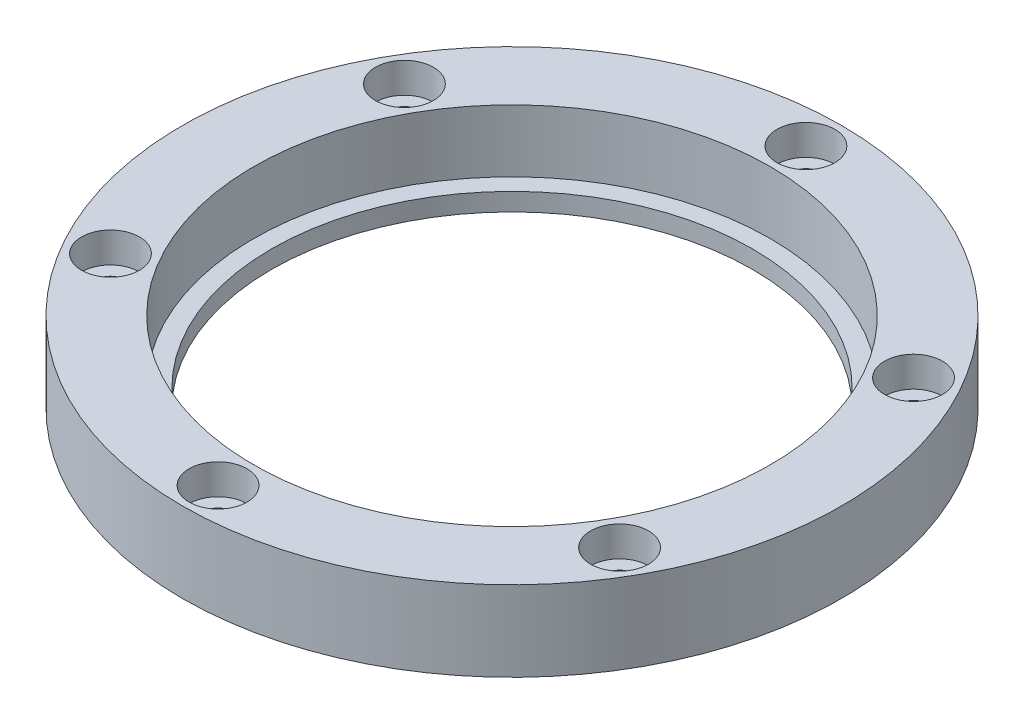
ISO-10303-21;
HEADER;
FILE_DESCRIPTION(('STEP AP214'),'2;1');
FILE_NAME('part.step','',(''),(''),'','','');
FILE_SCHEMA(('AUTOMOTIVE_DESIGN { 1 0 10303 214 1 1 1 1 }'));
ENDSEC;
DATA;
#1=APPLICATION_CONTEXT('core data for automotive mechanical design processes');
#2=APPLICATION_PROTOCOL_DEFINITION('international standard','automotive_design',2000,#1);
#3=PRODUCT_CONTEXT('',#1,'mechanical');
#4=PRODUCT('Part','Part','',(#3));
#5=PRODUCT_RELATED_PRODUCT_CATEGORY('part','',(#4));
#6=PRODUCT_DEFINITION_FORMATION('','',#4);
#7=PRODUCT_DEFINITION_CONTEXT('part definition',#1,'design');
#8=PRODUCT_DEFINITION('design','',#6,#7);
#9=PRODUCT_DEFINITION_SHAPE('','',#8);
#10=(LENGTH_UNIT() NAMED_UNIT(*) SI_UNIT(.MILLI.,.METRE.));
#11=(NAMED_UNIT(*) PLANE_ANGLE_UNIT() SI_UNIT($,.RADIAN.));
#12=(NAMED_UNIT(*) SI_UNIT($,.STERADIAN.) SOLID_ANGLE_UNIT());
#13=UNCERTAINTY_MEASURE_WITH_UNIT(LENGTH_MEASURE(1.E-05),#10,'distance_accuracy_value','');
#14=(GEOMETRIC_REPRESENTATION_CONTEXT(3) GLOBAL_UNCERTAINTY_ASSIGNED_CONTEXT((#13)) GLOBAL_UNIT_ASSIGNED_CONTEXT((#10,
#11,#12)) REPRESENTATION_CONTEXT('',''));
#15=CARTESIAN_POINT('',(0.,0.,0.));
#16=DIRECTION('',(0.,0.,1.));
#17=DIRECTION('',(1.,0.,0.));
#18=AXIS2_PLACEMENT_3D('',#15,#16,#17);
#19=CARTESIAN_POINT('',(0.,0.,0.));
#20=DIRECTION('',(0.,-1.,0.));
#21=DIRECTION('',(0.,0.,-1.));
#22=AXIS2_PLACEMENT_3D('',#19,#20,#21);
#23=CYLINDRICAL_SURFACE('',#22,27.);
#24=CARTESIAN_POINT('',(0.,0.,0.));
#25=DIRECTION('',(0.,-1.,0.));
#26=DIRECTION('',(0.,0.,-1.));
#27=AXIS2_PLACEMENT_3D('',#24,#25,#26);
#28=CIRCLE('',#27,27.);
#29=CARTESIAN_POINT('',(0.,0.,-27.));
#30=VERTEX_POINT('',#29);
#31=EDGE_CURVE('E10',#30,#30,#28,.T.);
#32=ORIENTED_EDGE('',*,*,#31,.T.);
#33=EDGE_LOOP('',(#32));
#34=FACE_BOUND('',#33,.T.);
#35=CARTESIAN_POINT('',(0.,2.,0.));
#36=DIRECTION('',(0.,-1.,0.));
#37=DIRECTION('',(0.,0.,-1.));
#38=AXIS2_PLACEMENT_3D('',#35,#36,#37);
#39=CIRCLE('',#38,27.);
#40=CARTESIAN_POINT('',(0.,2.,-27.));
#41=VERTEX_POINT('',#40);
#42=EDGE_CURVE('E70',#41,#41,#39,.T.);
#43=ORIENTED_EDGE('',*,*,#42,.F.);
#44=EDGE_LOOP('',(#43));
#45=FACE_BOUND('',#44,.T.);
#46=ADVANCED_FACE('F43',(#34,#45),#23,.F.);
#47=CARTESIAN_POINT('',(27.,0.,0.));
#48=DIRECTION('',(0.,-1.,0.));
#49=DIRECTION('',(0.,0.,-1.));
#50=AXIS2_PLACEMENT_3D('',#47,#48,#49);
#51=PLANE('',#50);
#52=CARTESIAN_POINT('',(0.,0.,33.));
#53=DIRECTION('',(0.,1.,0.));
#54=DIRECTION('',(0.,0.,1.));
#55=AXIS2_PLACEMENT_3D('',#52,#53,#54);
#56=CIRCLE('',#55,1.7);
#57=CARTESIAN_POINT('',(0.,0.,34.7));
#58=VERTEX_POINT('',#57);
#59=EDGE_CURVE('E154',#58,#58,#56,.T.);
#60=ORIENTED_EDGE('',*,*,#59,.T.);
#61=EDGE_LOOP('',(#60));
#62=FACE_BOUND('',#61,.T.);
#63=CARTESIAN_POINT('',(-28.5788383248865,0.,16.4999999999999));
#64=DIRECTION('',(0.,1.,0.));
#65=DIRECTION('',(0.,0.,1.));
#66=AXIS2_PLACEMENT_3D('',#63,#64,#65);
#67=CIRCLE('',#66,1.7);
#68=CARTESIAN_POINT('',(-28.5788383248865,0.,18.1999999999999));
#69=VERTEX_POINT('',#68);
#70=EDGE_CURVE('E138',#69,#69,#67,.T.);
#71=ORIENTED_EDGE('',*,*,#70,.T.);
#72=EDGE_LOOP('',(#71));
#73=FACE_BOUND('',#72,.T.);
#74=CARTESIAN_POINT('',(-28.5788383248864,0.,-16.5000000000001));
#75=DIRECTION('',(0.,1.,0.));
#76=DIRECTION('',(0.,0.,1.));
#77=AXIS2_PLACEMENT_3D('',#74,#75,#76);
#78=CIRCLE('',#77,1.7);
#79=CARTESIAN_POINT('',(-28.5788383248864,0.,-14.8000000000001));
#80=VERTEX_POINT('',#79);
#81=EDGE_CURVE('E122',#80,#80,#78,.T.);
#82=ORIENTED_EDGE('',*,*,#81,.T.);
#83=EDGE_LOOP('',(#82));
#84=FACE_BOUND('',#83,.T.);
#85=CARTESIAN_POINT('',(2.30437768363647E-13,0.,-33.));
#86=DIRECTION('',(0.,1.,0.));
#87=DIRECTION('',(0.,0.,1.));
#88=AXIS2_PLACEMENT_3D('',#85,#86,#87);
#89=CIRCLE('',#88,1.7);
#90=CARTESIAN_POINT('',(2.30437768363647E-13,0.,-31.3));
#91=VERTEX_POINT('',#90);
#92=EDGE_CURVE('E106',#91,#91,#89,.T.);
#93=ORIENTED_EDGE('',*,*,#92,.T.);
#94=EDGE_LOOP('',(#93));
#95=FACE_BOUND('',#94,.T.);
#96=CARTESIAN_POINT('',(28.5788383248866,0.,-16.4999999999997));
#97=DIRECTION('',(0.,1.,0.));
#98=DIRECTION('',(0.,0.,1.));
#99=AXIS2_PLACEMENT_3D('',#96,#97,#98);
#100=CIRCLE('',#99,1.7);
#101=CARTESIAN_POINT('',(28.5788383248866,0.,-14.7999999999997));
#102=VERTEX_POINT('',#101);
#103=EDGE_CURVE('E90',#102,#102,#100,.T.);
#104=ORIENTED_EDGE('',*,*,#103,.T.);
#105=EDGE_LOOP('',(#104));
#106=FACE_BOUND('',#105,.T.);
#107=CARTESIAN_POINT('',(28.5788383248863,0.,16.5000000000003));
#108=DIRECTION('',(0.,1.,0.));
#109=DIRECTION('',(0.,0.,1.));
#110=AXIS2_PLACEMENT_3D('',#107,#108,#109);
#111=CIRCLE('',#110,1.7);
#112=CARTESIAN_POINT('',(28.5788383248863,0.,18.2000000000003));
#113=VERTEX_POINT('',#112);
#114=EDGE_CURVE('E74',#113,#113,#111,.T.);
#115=ORIENTED_EDGE('',*,*,#114,.T.);
#116=EDGE_LOOP('',(#115));
#117=FACE_BOUND('',#116,.T.);
#118=CARTESIAN_POINT('',(0.,0.,0.));
#119=DIRECTION('',(0.,-1.,0.));
#120=DIRECTION('',(0.,0.,-1.));
#121=AXIS2_PLACEMENT_3D('',#118,#119,#120);
#122=CIRCLE('',#121,37.);
#123=CARTESIAN_POINT('',(0.,0.,-37.));
#124=VERTEX_POINT('',#123);
#125=EDGE_CURVE('E50',#124,#124,#122,.T.);
#126=ORIENTED_EDGE('',*,*,#125,.T.);
#127=EDGE_LOOP('',(#126));
#128=FACE_BOUND('',#127,.T.);
#129=ORIENTED_EDGE('',*,*,#31,.F.);
#130=EDGE_LOOP('',(#129));
#131=FACE_BOUND('',#130,.T.);
#132=ADVANCED_FACE('F195',(#62,#73,#84,#95,#106,#117,#128,#131),#51,.T.);
#133=CARTESIAN_POINT('',(0.,0.,0.));
#134=DIRECTION('',(0.,-1.,0.));
#135=DIRECTION('',(0.,0.,-1.));
#136=AXIS2_PLACEMENT_3D('',#133,#134,#135);
#137=CYLINDRICAL_SURFACE('',#136,37.);
#138=CARTESIAN_POINT('',(0.,9.,0.));
#139=DIRECTION('',(0.,-1.,0.));
#140=DIRECTION('',(0.,0.,-1.));
#141=AXIS2_PLACEMENT_3D('',#138,#139,#140);
#142=CIRCLE('',#141,37.);
#143=CARTESIAN_POINT('',(0.,9.,-37.));
#144=VERTEX_POINT('',#143);
#145=EDGE_CURVE('E55',#144,#144,#142,.T.);
#146=ORIENTED_EDGE('',*,*,#145,.T.);
#147=EDGE_LOOP('',(#146));
#148=FACE_BOUND('',#147,.T.);
#149=ORIENTED_EDGE('',*,*,#125,.F.);
#150=EDGE_LOOP('',(#149));
#151=FACE_BOUND('',#150,.T.);
#152=ADVANCED_FACE('F177',(#148,#151),#137,.T.);
#153=CARTESIAN_POINT('',(37.,9.,0.));
#154=DIRECTION('',(0.,1.,0.));
#155=DIRECTION('',(0.,0.,1.));
#156=AXIS2_PLACEMENT_3D('',#153,#154,#155);
#157=PLANE('',#156);
#158=CARTESIAN_POINT('',(0.,9.,33.));
#159=DIRECTION('',(0.,1.,0.));
#160=DIRECTION('',(0.,0.,1.));
#161=AXIS2_PLACEMENT_3D('',#158,#159,#160);
#162=CIRCLE('',#161,3.25);
#163=CARTESIAN_POINT('',(0.,9.,36.25));
#164=VERTEX_POINT('',#163);
#165=EDGE_CURVE('E166',#164,#164,#162,.T.);
#166=ORIENTED_EDGE('',*,*,#165,.F.);
#167=EDGE_LOOP('',(#166));
#168=FACE_BOUND('',#167,.T.);
#169=CARTESIAN_POINT('',(-28.5788383248865,9.,16.4999999999999));
#170=DIRECTION('',(0.,1.,0.));
#171=DIRECTION('',(0.,0.,1.));
#172=AXIS2_PLACEMENT_3D('',#169,#170,#171);
#173=CIRCLE('',#172,3.25);
#174=CARTESIAN_POINT('',(-28.5788383248865,9.,19.7499999999999));
#175=VERTEX_POINT('',#174);
#176=EDGE_CURVE('E150',#175,#175,#173,.T.);
#177=ORIENTED_EDGE('',*,*,#176,.F.);
#178=EDGE_LOOP('',(#177));
#179=FACE_BOUND('',#178,.T.);
#180=CARTESIAN_POINT('',(-28.5788383248864,9.,-16.5000000000001));
#181=DIRECTION('',(0.,1.,0.));
#182=DIRECTION('',(0.,0.,1.));
#183=AXIS2_PLACEMENT_3D('',#180,#181,#182);
#184=CIRCLE('',#183,3.25);
#185=CARTESIAN_POINT('',(-28.5788383248864,9.,-13.2500000000001));
#186=VERTEX_POINT('',#185);
#187=EDGE_CURVE('E134',#186,#186,#184,.T.);
#188=ORIENTED_EDGE('',*,*,#187,.F.);
#189=EDGE_LOOP('',(#188));
#190=FACE_BOUND('',#189,.T.);
#191=CARTESIAN_POINT('',(2.30437768363647E-13,9.,-33.));
#192=DIRECTION('',(0.,1.,0.));
#193=DIRECTION('',(0.,0.,1.));
#194=AXIS2_PLACEMENT_3D('',#191,#192,#193);
#195=CIRCLE('',#194,3.25);
#196=CARTESIAN_POINT('',(2.30437768363647E-13,9.,-29.75));
#197=VERTEX_POINT('',#196);
#198=EDGE_CURVE('E118',#197,#197,#195,.T.);
#199=ORIENTED_EDGE('',*,*,#198,.F.);
#200=EDGE_LOOP('',(#199));
#201=FACE_BOUND('',#200,.T.);
#202=CARTESIAN_POINT('',(28.5788383248866,9.,-16.4999999999997));
#203=DIRECTION('',(0.,1.,0.));
#204=DIRECTION('',(0.,0.,1.));
#205=AXIS2_PLACEMENT_3D('',#202,#203,#204);
#206=CIRCLE('',#205,3.24999999999999);
#207=CARTESIAN_POINT('',(28.5788383248866,9.,-13.2499999999997));
#208=VERTEX_POINT('',#207);
#209=EDGE_CURVE('E102',#208,#208,#206,.T.);
#210=ORIENTED_EDGE('',*,*,#209,.F.);
#211=EDGE_LOOP('',(#210));
#212=FACE_BOUND('',#211,.T.);
#213=CARTESIAN_POINT('',(28.5788383248863,9.,16.5000000000003));
#214=DIRECTION('',(0.,1.,0.));
#215=DIRECTION('',(0.,0.,1.));
#216=AXIS2_PLACEMENT_3D('',#213,#214,#215);
#217=CIRCLE('',#216,3.25);
#218=CARTESIAN_POINT('',(28.5788383248863,9.,19.7500000000003));
#219=VERTEX_POINT('',#218);
#220=EDGE_CURVE('E86',#219,#219,#217,.T.);
#221=ORIENTED_EDGE('',*,*,#220,.F.);
#222=EDGE_LOOP('',(#221));
#223=FACE_BOUND('',#222,.T.);
#224=CARTESIAN_POINT('',(0.,9.,0.));
#225=DIRECTION('',(0.,-1.,0.));
#226=DIRECTION('',(0.,0.,-1.));
#227=AXIS2_PLACEMENT_3D('',#224,#225,#226);
#228=CIRCLE('',#227,29.);
#229=CARTESIAN_POINT('',(0.,9.,-29.));
#230=VERTEX_POINT('',#229);
#231=EDGE_CURVE('E60',#230,#230,#228,.T.);
#232=ORIENTED_EDGE('',*,*,#231,.T.);
#233=EDGE_LOOP('',(#232));
#234=FACE_BOUND('',#233,.T.);
#235=ORIENTED_EDGE('',*,*,#145,.F.);
#236=EDGE_LOOP('',(#235));
#237=FACE_BOUND('',#236,.T.);
#238=ADVANCED_FACE('F173',(#168,#179,#190,#201,#212,#223,#234,#237),#157,.T.);
#239=CARTESIAN_POINT('',(0.,0.,0.));
#240=DIRECTION('',(0.,-1.,0.));
#241=DIRECTION('',(0.,0.,-1.));
#242=AXIS2_PLACEMENT_3D('',#239,#240,#241);
#243=CYLINDRICAL_SURFACE('',#242,29.);
#244=CARTESIAN_POINT('',(0.,2.,0.));
#245=DIRECTION('',(0.,-1.,0.));
#246=DIRECTION('',(0.,0.,-1.));
#247=AXIS2_PLACEMENT_3D('',#244,#245,#246);
#248=CIRCLE('',#247,29.);
#249=CARTESIAN_POINT('',(0.,2.,-29.));
#250=VERTEX_POINT('',#249);
#251=EDGE_CURVE('E66',#250,#250,#248,.T.);
#252=ORIENTED_EDGE('',*,*,#251,.T.);
#253=EDGE_LOOP('',(#252));
#254=FACE_BOUND('',#253,.T.);
#255=ORIENTED_EDGE('',*,*,#231,.F.);
#256=EDGE_LOOP('',(#255));
#257=FACE_BOUND('',#256,.T.);
#258=ADVANCED_FACE('F176',(#254,#257),#243,.F.);
#259=CARTESIAN_POINT('',(29.,2.,0.));
#260=DIRECTION('',(0.,1.,0.));
#261=DIRECTION('',(0.,0.,1.));
#262=AXIS2_PLACEMENT_3D('',#259,#260,#261);
#263=PLANE('',#262);
#264=ORIENTED_EDGE('',*,*,#42,.T.);
#265=EDGE_LOOP('',(#264));
#266=FACE_BOUND('',#265,.T.);
#267=ORIENTED_EDGE('',*,*,#251,.F.);
#268=EDGE_LOOP('',(#267));
#269=FACE_BOUND('',#268,.T.);
#270=ADVANCED_FACE('F208',(#266,#269),#263,.T.);
#271=CARTESIAN_POINT('',(28.5788383248863,9.,16.5000000000003));
#272=DIRECTION('',(0.,1.,0.));
#273=DIRECTION('',(0.,0.,1.));
#274=AXIS2_PLACEMENT_3D('',#271,#272,#273);
#275=CYLINDRICAL_SURFACE('',#274,1.70000000000001);
#276=ORIENTED_EDGE('',*,*,#114,.F.);
#277=EDGE_LOOP('',(#276));
#278=FACE_BOUND('',#277,.T.);
#279=CARTESIAN_POINT('',(28.5788383248863,5.6,16.5000000000003));
#280=DIRECTION('',(0.,1.,0.));
#281=DIRECTION('',(0.,0.,1.));
#282=AXIS2_PLACEMENT_3D('',#279,#280,#281);
#283=CIRCLE('',#282,1.70000000000001);
#284=CARTESIAN_POINT('',(28.5788383248863,5.6,18.2000000000003));
#285=VERTEX_POINT('',#284);
#286=EDGE_CURVE('E78',#285,#285,#283,.T.);
#287=ORIENTED_EDGE('',*,*,#286,.T.);
#288=EDGE_LOOP('',(#287));
#289=FACE_BOUND('',#288,.T.);
#290=ADVANCED_FACE('F211',(#278,#289),#275,.F.);
#291=CARTESIAN_POINT('',(30.2788383248863,5.6,16.5000000000003));
#292=DIRECTION('',(0.,-1.,0.));
#293=DIRECTION('',(0.,0.,-1.));
#294=AXIS2_PLACEMENT_3D('',#291,#292,#293);
#295=PLANE('',#294);
#296=ORIENTED_EDGE('',*,*,#286,.F.);
#297=EDGE_LOOP('',(#296));
#298=FACE_BOUND('',#297,.T.);
#299=CARTESIAN_POINT('',(28.5788383248863,5.6,16.5000000000003));
#300=DIRECTION('',(0.,1.,0.));
#301=DIRECTION('',(0.,0.,1.));
#302=AXIS2_PLACEMENT_3D('',#299,#300,#301);
#303=CIRCLE('',#302,3.25);
#304=CARTESIAN_POINT('',(28.5788383248863,5.6,19.7500000000003));
#305=VERTEX_POINT('',#304);
#306=EDGE_CURVE('E82',#305,#305,#303,.T.);
#307=ORIENTED_EDGE('',*,*,#306,.T.);
#308=EDGE_LOOP('',(#307));
#309=FACE_BOUND('',#308,.T.);
#310=ADVANCED_FACE('F222',(#298,#309),#295,.F.);
#311=CARTESIAN_POINT('',(28.5788383248863,9.,16.5000000000003));
#312=DIRECTION('',(0.,1.,0.));
#313=DIRECTION('',(0.,0.,1.));
#314=AXIS2_PLACEMENT_3D('',#311,#312,#313);
#315=CYLINDRICAL_SURFACE('',#314,3.25);
#316=ORIENTED_EDGE('',*,*,#306,.F.);
#317=EDGE_LOOP('',(#316));
#318=FACE_BOUND('',#317,.T.);
#319=ORIENTED_EDGE('',*,*,#220,.T.);
#320=EDGE_LOOP('',(#319));
#321=FACE_BOUND('',#320,.T.);
#322=ADVANCED_FACE('F226',(#318,#321),#315,.F.);
#323=CARTESIAN_POINT('',(28.5788383248866,9.,-16.4999999999997));
#324=DIRECTION('',(0.,1.,0.));
#325=DIRECTION('',(0.,0.,1.));
#326=AXIS2_PLACEMENT_3D('',#323,#324,#325);
#327=CYLINDRICAL_SURFACE('',#326,1.7);
#328=ORIENTED_EDGE('',*,*,#103,.F.);
#329=EDGE_LOOP('',(#328));
#330=FACE_BOUND('',#329,.T.);
#331=CARTESIAN_POINT('',(28.5788383248866,5.6,-16.4999999999997));
#332=DIRECTION('',(0.,1.,0.));
#333=DIRECTION('',(0.,0.,1.));
#334=AXIS2_PLACEMENT_3D('',#331,#332,#333);
#335=CIRCLE('',#334,1.70000000000001);
#336=CARTESIAN_POINT('',(28.5788383248866,5.6,-14.7999999999997));
#337=VERTEX_POINT('',#336);
#338=EDGE_CURVE('E94',#337,#337,#335,.T.);
#339=ORIENTED_EDGE('',*,*,#338,.T.);
#340=EDGE_LOOP('',(#339));
#341=FACE_BOUND('',#340,.T.);
#342=ADVANCED_FACE('F230',(#330,#341),#327,.F.);
#343=CARTESIAN_POINT('',(30.2788383248866,5.6,-16.4999999999997));
#344=DIRECTION('',(0.,-1.,0.));
#345=DIRECTION('',(0.,0.,-1.));
#346=AXIS2_PLACEMENT_3D('',#343,#344,#345);
#347=PLANE('',#346);
#348=ORIENTED_EDGE('',*,*,#338,.F.);
#349=EDGE_LOOP('',(#348));
#350=FACE_BOUND('',#349,.T.);
#351=CARTESIAN_POINT('',(28.5788383248866,5.6,-16.4999999999997));
#352=DIRECTION('',(0.,1.,0.));
#353=DIRECTION('',(0.,0.,1.));
#354=AXIS2_PLACEMENT_3D('',#351,#352,#353);
#355=CIRCLE('',#354,3.24999999999999);
#356=CARTESIAN_POINT('',(28.5788383248866,5.6,-13.2499999999997));
#357=VERTEX_POINT('',#356);
#358=EDGE_CURVE('E98',#357,#357,#355,.T.);
#359=ORIENTED_EDGE('',*,*,#358,.T.);
#360=EDGE_LOOP('',(#359));
#361=FACE_BOUND('',#360,.T.);
#362=ADVANCED_FACE('F234',(#350,#361),#347,.F.);
#363=CARTESIAN_POINT('',(28.5788383248866,9.,-16.4999999999997));
#364=DIRECTION('',(0.,1.,0.));
#365=DIRECTION('',(0.,0.,1.));
#366=AXIS2_PLACEMENT_3D('',#363,#364,#365);
#367=CYLINDRICAL_SURFACE('',#366,3.24999999999999);
#368=ORIENTED_EDGE('',*,*,#358,.F.);
#369=EDGE_LOOP('',(#368));
#370=FACE_BOUND('',#369,.T.);
#371=ORIENTED_EDGE('',*,*,#209,.T.);
#372=EDGE_LOOP('',(#371));
#373=FACE_BOUND('',#372,.T.);
#374=ADVANCED_FACE('F238',(#370,#373),#367,.F.);
#375=CARTESIAN_POINT('',(2.30437768363647E-13,9.,-33.));
#376=DIRECTION('',(0.,1.,0.));
#377=DIRECTION('',(0.,0.,1.));
#378=AXIS2_PLACEMENT_3D('',#375,#376,#377);
#379=CYLINDRICAL_SURFACE('',#378,1.7);
#380=ORIENTED_EDGE('',*,*,#92,.F.);
#381=EDGE_LOOP('',(#380));
#382=FACE_BOUND('',#381,.T.);
#383=CARTESIAN_POINT('',(2.30437768363647E-13,5.6,-33.));
#384=DIRECTION('',(0.,1.,0.));
#385=DIRECTION('',(0.,0.,1.));
#386=AXIS2_PLACEMENT_3D('',#383,#384,#385);
#387=CIRCLE('',#386,1.70000000000001);
#388=CARTESIAN_POINT('',(2.30437768363647E-13,5.6,-31.3));
#389=VERTEX_POINT('',#388);
#390=EDGE_CURVE('E110',#389,#389,#387,.T.);
#391=ORIENTED_EDGE('',*,*,#390,.T.);
#392=EDGE_LOOP('',(#391));
#393=FACE_BOUND('',#392,.T.);
#394=ADVANCED_FACE('F242',(#382,#393),#379,.F.);
#395=CARTESIAN_POINT('',(1.70000000000024,5.6,-33.));
#396=DIRECTION('',(0.,-1.,0.));
#397=DIRECTION('',(0.,0.,-1.));
#398=AXIS2_PLACEMENT_3D('',#395,#396,#397);
#399=PLANE('',#398);
#400=ORIENTED_EDGE('',*,*,#390,.F.);
#401=EDGE_LOOP('',(#400));
#402=FACE_BOUND('',#401,.T.);
#403=CARTESIAN_POINT('',(2.30437768363647E-13,5.6,-33.));
#404=DIRECTION('',(0.,1.,0.));
#405=DIRECTION('',(0.,0.,1.));
#406=AXIS2_PLACEMENT_3D('',#403,#404,#405);
#407=CIRCLE('',#406,3.25);
#408=CARTESIAN_POINT('',(2.30437768363647E-13,5.6,-29.75));
#409=VERTEX_POINT('',#408);
#410=EDGE_CURVE('E114',#409,#409,#407,.T.);
#411=ORIENTED_EDGE('',*,*,#410,.T.);
#412=EDGE_LOOP('',(#411));
#413=FACE_BOUND('',#412,.T.);
#414=ADVANCED_FACE('F246',(#402,#413),#399,.F.);
#415=CARTESIAN_POINT('',(2.30437768363647E-13,9.,-33.));
#416=DIRECTION('',(0.,1.,0.));
#417=DIRECTION('',(0.,0.,1.));
#418=AXIS2_PLACEMENT_3D('',#415,#416,#417);
#419=CYLINDRICAL_SURFACE('',#418,3.25);
#420=ORIENTED_EDGE('',*,*,#410,.F.);
#421=EDGE_LOOP('',(#420));
#422=FACE_BOUND('',#421,.T.);
#423=ORIENTED_EDGE('',*,*,#198,.T.);
#424=EDGE_LOOP('',(#423));
#425=FACE_BOUND('',#424,.T.);
#426=ADVANCED_FACE('F250',(#422,#425),#419,.F.);
#427=CARTESIAN_POINT('',(-28.5788383248864,9.,-16.5000000000001));
#428=DIRECTION('',(0.,1.,0.));
#429=DIRECTION('',(0.,0.,1.));
#430=AXIS2_PLACEMENT_3D('',#427,#428,#429);
#431=CYLINDRICAL_SURFACE('',#430,1.70000000000001);
#432=ORIENTED_EDGE('',*,*,#81,.F.);
#433=EDGE_LOOP('',(#432));
#434=FACE_BOUND('',#433,.T.);
#435=CARTESIAN_POINT('',(-28.5788383248864,5.6,-16.5000000000001));
#436=DIRECTION('',(0.,1.,0.));
#437=DIRECTION('',(0.,0.,1.));
#438=AXIS2_PLACEMENT_3D('',#435,#436,#437);
#439=CIRCLE('',#438,1.70000000000001);
#440=CARTESIAN_POINT('',(-28.5788383248864,5.6,-14.8000000000001));
#441=VERTEX_POINT('',#440);
#442=EDGE_CURVE('E126',#441,#441,#439,.T.);
#443=ORIENTED_EDGE('',*,*,#442,.T.);
#444=EDGE_LOOP('',(#443));
#445=FACE_BOUND('',#444,.T.);
#446=ADVANCED_FACE('F254',(#434,#445),#431,.F.);
#447=CARTESIAN_POINT('',(-26.8788383248864,5.6,-16.5000000000001));
#448=DIRECTION('',(0.,-1.,0.));
#449=DIRECTION('',(0.,0.,-1.));
#450=AXIS2_PLACEMENT_3D('',#447,#448,#449);
#451=PLANE('',#450);
#452=ORIENTED_EDGE('',*,*,#442,.F.);
#453=EDGE_LOOP('',(#452));
#454=FACE_BOUND('',#453,.T.);
#455=CARTESIAN_POINT('',(-28.5788383248864,5.6,-16.5000000000001));
#456=DIRECTION('',(0.,1.,0.));
#457=DIRECTION('',(0.,0.,1.));
#458=AXIS2_PLACEMENT_3D('',#455,#456,#457);
#459=CIRCLE('',#458,3.25);
#460=CARTESIAN_POINT('',(-28.5788383248864,5.6,-13.2500000000001));
#461=VERTEX_POINT('',#460);
#462=EDGE_CURVE('E130',#461,#461,#459,.T.);
#463=ORIENTED_EDGE('',*,*,#462,.T.);
#464=EDGE_LOOP('',(#463));
#465=FACE_BOUND('',#464,.T.);
#466=ADVANCED_FACE('F258',(#454,#465),#451,.F.);
#467=CARTESIAN_POINT('',(-28.5788383248864,9.,-16.5000000000001));
#468=DIRECTION('',(0.,1.,0.));
#469=DIRECTION('',(0.,0.,1.));
#470=AXIS2_PLACEMENT_3D('',#467,#468,#469);
#471=CYLINDRICAL_SURFACE('',#470,3.25);
#472=ORIENTED_EDGE('',*,*,#462,.F.);
#473=EDGE_LOOP('',(#472));
#474=FACE_BOUND('',#473,.T.);
#475=ORIENTED_EDGE('',*,*,#187,.T.);
#476=EDGE_LOOP('',(#475));
#477=FACE_BOUND('',#476,.T.);
#478=ADVANCED_FACE('F262',(#474,#477),#471,.F.);
#479=CARTESIAN_POINT('',(-28.5788383248865,9.,16.4999999999999));
#480=DIRECTION('',(0.,1.,0.));
#481=DIRECTION('',(0.,0.,1.));
#482=AXIS2_PLACEMENT_3D('',#479,#480,#481);
#483=CYLINDRICAL_SURFACE('',#482,1.70000000000001);
#484=ORIENTED_EDGE('',*,*,#70,.F.);
#485=EDGE_LOOP('',(#484));
#486=FACE_BOUND('',#485,.T.);
#487=CARTESIAN_POINT('',(-28.5788383248865,5.6,16.4999999999999));
#488=DIRECTION('',(0.,1.,0.));
#489=DIRECTION('',(0.,0.,1.));
#490=AXIS2_PLACEMENT_3D('',#487,#488,#489);
#491=CIRCLE('',#490,1.70000000000001);
#492=CARTESIAN_POINT('',(-28.5788383248865,5.6,18.1999999999999));
#493=VERTEX_POINT('',#492);
#494=EDGE_CURVE('E142',#493,#493,#491,.T.);
#495=ORIENTED_EDGE('',*,*,#494,.T.);
#496=EDGE_LOOP('',(#495));
#497=FACE_BOUND('',#496,.T.);
#498=ADVANCED_FACE('F266',(#486,#497),#483,.F.);
#499=CARTESIAN_POINT('',(-26.8788383248865,5.6,16.4999999999999));
#500=DIRECTION('',(0.,-1.,0.));
#501=DIRECTION('',(0.,0.,-1.));
#502=AXIS2_PLACEMENT_3D('',#499,#500,#501);
#503=PLANE('',#502);
#504=ORIENTED_EDGE('',*,*,#494,.F.);
#505=EDGE_LOOP('',(#504));
#506=FACE_BOUND('',#505,.T.);
#507=CARTESIAN_POINT('',(-28.5788383248865,5.6,16.4999999999999));
#508=DIRECTION('',(0.,1.,0.));
#509=DIRECTION('',(0.,0.,1.));
#510=AXIS2_PLACEMENT_3D('',#507,#508,#509);
#511=CIRCLE('',#510,3.25);
#512=CARTESIAN_POINT('',(-28.5788383248865,5.6,19.7499999999999));
#513=VERTEX_POINT('',#512);
#514=EDGE_CURVE('E146',#513,#513,#511,.T.);
#515=ORIENTED_EDGE('',*,*,#514,.T.);
#516=EDGE_LOOP('',(#515));
#517=FACE_BOUND('',#516,.T.);
#518=ADVANCED_FACE('F270',(#506,#517),#503,.F.);
#519=CARTESIAN_POINT('',(-28.5788383248865,9.,16.4999999999999));
#520=DIRECTION('',(0.,1.,0.));
#521=DIRECTION('',(0.,0.,1.));
#522=AXIS2_PLACEMENT_3D('',#519,#520,#521);
#523=CYLINDRICAL_SURFACE('',#522,3.25);
#524=ORIENTED_EDGE('',*,*,#514,.F.);
#525=EDGE_LOOP('',(#524));
#526=FACE_BOUND('',#525,.T.);
#527=ORIENTED_EDGE('',*,*,#176,.T.);
#528=EDGE_LOOP('',(#527));
#529=FACE_BOUND('',#528,.T.);
#530=ADVANCED_FACE('F274',(#526,#529),#523,.F.);
#531=CARTESIAN_POINT('',(0.,9.,33.));
#532=DIRECTION('',(0.,1.,0.));
#533=DIRECTION('',(0.,0.,1.));
#534=AXIS2_PLACEMENT_3D('',#531,#532,#533);
#535=CYLINDRICAL_SURFACE('',#534,1.7);
#536=ORIENTED_EDGE('',*,*,#59,.F.);
#537=EDGE_LOOP('',(#536));
#538=FACE_BOUND('',#537,.T.);
#539=CARTESIAN_POINT('',(0.,5.6,33.));
#540=DIRECTION('',(0.,1.,0.));
#541=DIRECTION('',(0.,0.,1.));
#542=AXIS2_PLACEMENT_3D('',#539,#540,#541);
#543=CIRCLE('',#542,1.70000000000001);
#544=CARTESIAN_POINT('',(0.,5.6,34.7));
#545=VERTEX_POINT('',#544);
#546=EDGE_CURVE('E158',#545,#545,#543,.T.);
#547=ORIENTED_EDGE('',*,*,#546,.T.);
#548=EDGE_LOOP('',(#547));
#549=FACE_BOUND('',#548,.T.);
#550=ADVANCED_FACE('F278',(#538,#549),#535,.F.);
#551=CARTESIAN_POINT('',(1.70000000000001,5.6,33.));
#552=DIRECTION('',(0.,-1.,0.));
#553=DIRECTION('',(0.,0.,-1.));
#554=AXIS2_PLACEMENT_3D('',#551,#552,#553);
#555=PLANE('',#554);
#556=ORIENTED_EDGE('',*,*,#546,.F.);
#557=EDGE_LOOP('',(#556));
#558=FACE_BOUND('',#557,.T.);
#559=CARTESIAN_POINT('',(0.,5.6,33.));
#560=DIRECTION('',(0.,1.,0.));
#561=DIRECTION('',(0.,0.,1.));
#562=AXIS2_PLACEMENT_3D('',#559,#560,#561);
#563=CIRCLE('',#562,3.25);
#564=CARTESIAN_POINT('',(0.,5.6,36.25));
#565=VERTEX_POINT('',#564);
#566=EDGE_CURVE('E162',#565,#565,#563,.T.);
#567=ORIENTED_EDGE('',*,*,#566,.T.);
#568=EDGE_LOOP('',(#567));
#569=FACE_BOUND('',#568,.T.);
#570=ADVANCED_FACE('F282',(#558,#569),#555,.F.);
#571=CARTESIAN_POINT('',(0.,9.,33.));
#572=DIRECTION('',(0.,1.,0.));
#573=DIRECTION('',(0.,0.,1.));
#574=AXIS2_PLACEMENT_3D('',#571,#572,#573);
#575=CYLINDRICAL_SURFACE('',#574,3.25);
#576=ORIENTED_EDGE('',*,*,#566,.F.);
#577=EDGE_LOOP('',(#576));
#578=FACE_BOUND('',#577,.T.);
#579=ORIENTED_EDGE('',*,*,#165,.T.);
#580=EDGE_LOOP('',(#579));
#581=FACE_BOUND('',#580,.T.);
#582=ADVANCED_FACE('F171',(#578,#581),#575,.F.);
#583=CLOSED_SHELL('',(#46,#132,#152,#238,#258,#270,#290,#310,#322,#342,#362,#374,#394,#414,#426,
#446,#466,#478,#498,#518,#530,#550,#570,#582));
#584=MANIFOLD_SOLID_BREP('B2',#583);
#585=ADVANCED_BREP_SHAPE_REPRESENTATION('',(#18,#584),#14);
#586=SHAPE_DEFINITION_REPRESENTATION(#9,#585);
ENDSEC;
END-ISO-10303-21;
